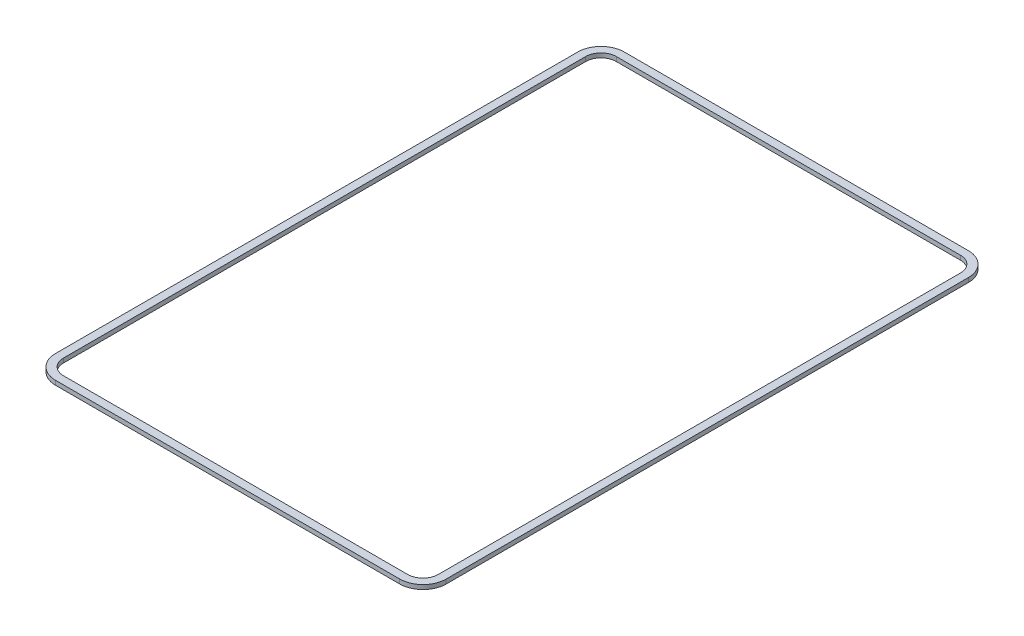
ISO-10303-21;
HEADER;
FILE_DESCRIPTION(('STEP AP214'),'2;1');
FILE_NAME('part.step','',(''),(''),'','','');
FILE_SCHEMA(('AUTOMOTIVE_DESIGN { 1 0 10303 214 1 1 1 1 }'));
ENDSEC;
DATA;
#1=APPLICATION_CONTEXT('core data for automotive mechanical design processes');
#2=APPLICATION_PROTOCOL_DEFINITION('international standard','automotive_design',2000,#1);
#3=PRODUCT_CONTEXT('',#1,'mechanical');
#4=PRODUCT('Part','Part','',(#3));
#5=PRODUCT_RELATED_PRODUCT_CATEGORY('part','',(#4));
#6=PRODUCT_DEFINITION_FORMATION('','',#4);
#7=PRODUCT_DEFINITION_CONTEXT('part definition',#1,'design');
#8=PRODUCT_DEFINITION('design','',#6,#7);
#9=PRODUCT_DEFINITION_SHAPE('','',#8);
#10=(LENGTH_UNIT() NAMED_UNIT(*) SI_UNIT(.MILLI.,.METRE.));
#11=(NAMED_UNIT(*) PLANE_ANGLE_UNIT() SI_UNIT($,.RADIAN.));
#12=(NAMED_UNIT(*) SI_UNIT($,.STERADIAN.) SOLID_ANGLE_UNIT());
#13=UNCERTAINTY_MEASURE_WITH_UNIT(LENGTH_MEASURE(1.E-05),#10,'distance_accuracy_value','');
#14=(GEOMETRIC_REPRESENTATION_CONTEXT(3) GLOBAL_UNCERTAINTY_ASSIGNED_CONTEXT((#13)) GLOBAL_UNIT_ASSIGNED_CONTEXT((#10,
#11,#12)) REPRESENTATION_CONTEXT('',''));
#15=CARTESIAN_POINT('',(0.,0.,0.));
#16=DIRECTION('',(0.,0.,1.));
#17=DIRECTION('',(1.,0.,0.));
#18=AXIS2_PLACEMENT_3D('',#15,#16,#17);
#19=CARTESIAN_POINT('',(-94.75,-113.7,10.25));
#20=DIRECTION('',(0.,0.,1.));
#21=DIRECTION('',(1.,0.,0.));
#22=AXIS2_PLACEMENT_3D('',#19,#20,#21);
#23=PLANE('',#22);
#24=DIRECTION('',(-1.,0.,0.));
#25=VECTOR('',#24,1.);
#26=CARTESIAN_POINT('',(-47.375,-113.8,10.25));
#27=LINE('',#26,#25);
#28=CARTESIAN_POINT('',(87.,-113.8,10.25));
#29=VERTEX_POINT('',#28);
#30=CARTESIAN_POINT('',(-87.,-113.8,10.25));
#31=VERTEX_POINT('',#30);
#32=EDGE_CURVE('E182',#29,#31,#27,.T.);
#33=ORIENTED_EDGE('',*,*,#32,.T.);
#34=DIRECTION('',(0.,-1.,0.));
#35=VECTOR('',#34,1.);
#36=CARTESIAN_POINT('',(-87.,-113.7,10.25));
#37=LINE('',#36,#35);
#38=CARTESIAN_POINT('',(-87.,-116.,10.25));
#39=VERTEX_POINT('',#38);
#40=EDGE_CURVE('E10',#31,#39,#37,.T.);
#41=ORIENTED_EDGE('',*,*,#40,.T.);
#42=DIRECTION('',(-1.,0.,0.));
#43=VECTOR('',#42,1.);
#44=CARTESIAN_POINT('',(-47.375,-116.,10.25));
#45=LINE('',#44,#43);
#46=CARTESIAN_POINT('',(87.,-116.,10.25));
#47=VERTEX_POINT('',#46);
#48=EDGE_CURVE('E238',#47,#39,#45,.T.);
#49=ORIENTED_EDGE('',*,*,#48,.F.);
#50=DIRECTION('',(0.,-1.,0.));
#51=VECTOR('',#50,1.);
#52=CARTESIAN_POINT('',(87.,-113.7,10.25));
#53=LINE('',#52,#51);
#54=EDGE_CURVE('E208',#29,#47,#53,.T.);
#55=ORIENTED_EDGE('',*,*,#54,.F.);
#56=EDGE_LOOP('',(#33,#41,#49,#55));
#57=FACE_BOUND('',#56,.T.);
#58=ADVANCED_FACE('F16',(#57),#23,.T.);
#59=CARTESIAN_POINT('',(-87.,-113.7,18.));
#60=DIRECTION('',(0.,-1.,0.));
#61=DIRECTION('',(0.,0.,-1.));
#62=AXIS2_PLACEMENT_3D('',#59,#60,#61);
#63=CYLINDRICAL_SURFACE('',#62,7.75);
#64=ORIENTED_EDGE('',*,*,#40,.F.);
#65=CARTESIAN_POINT('',(-87.,-113.8,18.));
#66=DIRECTION('',(0.,-1.,0.));
#67=DIRECTION('',(0.,0.,-1.));
#68=AXIS2_PLACEMENT_3D('',#65,#66,#67);
#69=CIRCLE('',#68,7.75);
#70=CARTESIAN_POINT('',(-94.75,-113.8,18.));
#71=VERTEX_POINT('',#70);
#72=EDGE_CURVE('E276',#71,#31,#69,.T.);
#73=ORIENTED_EDGE('',*,*,#72,.F.);
#74=DIRECTION('',(0.,-1.,0.));
#75=VECTOR('',#74,1.);
#76=CARTESIAN_POINT('',(-94.75,-113.7,18.));
#77=LINE('',#76,#75);
#78=CARTESIAN_POINT('',(-94.75,-116.,18.));
#79=VERTEX_POINT('',#78);
#80=EDGE_CURVE('E27',#71,#79,#77,.T.);
#81=ORIENTED_EDGE('',*,*,#80,.T.);
#82=CARTESIAN_POINT('',(-87.,-116.,18.));
#83=DIRECTION('',(0.,-1.,0.));
#84=DIRECTION('',(0.,0.,-1.));
#85=AXIS2_PLACEMENT_3D('',#82,#83,#84);
#86=CIRCLE('',#85,7.75);
#87=EDGE_CURVE('E233',#79,#39,#86,.T.);
#88=ORIENTED_EDGE('',*,*,#87,.T.);
#89=EDGE_LOOP('',(#64,#73,#81,#88));
#90=FACE_BOUND('',#89,.T.);
#91=ADVANCED_FACE('F382',(#90),#63,.F.);
#92=CARTESIAN_POINT('',(-94.75,-113.7,289.75));
#93=DIRECTION('',(1.,0.,0.));
#94=DIRECTION('',(0.,1.,0.));
#95=AXIS2_PLACEMENT_3D('',#92,#93,#94);
#96=PLANE('',#95);
#97=DIRECTION('',(0.,0.,1.));
#98=VECTOR('',#97,1.);
#99=CARTESIAN_POINT('',(-94.75,-113.8,219.875));
#100=LINE('',#99,#98);
#101=CARTESIAN_POINT('',(-94.75,-113.8,282.));
#102=VERTEX_POINT('',#101);
#103=EDGE_CURVE('E273',#71,#102,#100,.T.);
#104=ORIENTED_EDGE('',*,*,#103,.T.);
#105=DIRECTION('',(0.,-1.,0.));
#106=VECTOR('',#105,1.);
#107=CARTESIAN_POINT('',(-94.75,-113.7,282.));
#108=LINE('',#107,#106);
#109=CARTESIAN_POINT('',(-94.75,-116.,282.));
#110=VERTEX_POINT('',#109);
#111=EDGE_CURVE('E224',#102,#110,#108,.T.);
#112=ORIENTED_EDGE('',*,*,#111,.T.);
#113=DIRECTION('',(0.,0.,1.));
#114=VECTOR('',#113,1.);
#115=CARTESIAN_POINT('',(-94.75,-116.,219.875));
#116=LINE('',#115,#114);
#117=EDGE_CURVE('E237',#79,#110,#116,.T.);
#118=ORIENTED_EDGE('',*,*,#117,.F.);
#119=ORIENTED_EDGE('',*,*,#80,.F.);
#120=EDGE_LOOP('',(#104,#112,#118,#119));
#121=FACE_BOUND('',#120,.T.);
#122=ADVANCED_FACE('F386',(#121),#96,.T.);
#123=CARTESIAN_POINT('',(-87.,-113.7,282.));
#124=DIRECTION('',(0.,-1.,0.));
#125=DIRECTION('',(0.,0.,1.));
#126=AXIS2_PLACEMENT_3D('',#123,#124,#125);
#127=CYLINDRICAL_SURFACE('',#126,7.75);
#128=CARTESIAN_POINT('',(-87.,-116.,282.));
#129=DIRECTION('',(0.,-1.,0.));
#130=DIRECTION('',(0.,0.,1.));
#131=AXIS2_PLACEMENT_3D('',#128,#129,#130);
#132=CIRCLE('',#131,7.75);
#133=CARTESIAN_POINT('',(-87.,-116.,289.75));
#134=VERTEX_POINT('',#133);
#135=EDGE_CURVE('E284',#134,#110,#132,.T.);
#136=ORIENTED_EDGE('',*,*,#135,.T.);
#137=ORIENTED_EDGE('',*,*,#111,.F.);
#138=CARTESIAN_POINT('',(-87.,-113.8,282.));
#139=DIRECTION('',(0.,-1.,0.));
#140=DIRECTION('',(0.,0.,1.));
#141=AXIS2_PLACEMENT_3D('',#138,#139,#140);
#142=CIRCLE('',#141,7.75);
#143=CARTESIAN_POINT('',(-87.,-113.8,289.75));
#144=VERTEX_POINT('',#143);
#145=EDGE_CURVE('E269',#144,#102,#142,.T.);
#146=ORIENTED_EDGE('',*,*,#145,.F.);
#147=DIRECTION('',(0.,-1.,0.));
#148=VECTOR('',#147,1.);
#149=CARTESIAN_POINT('',(-87.,-113.7,289.75));
#150=LINE('',#149,#148);
#151=EDGE_CURVE('E223',#144,#134,#150,.T.);
#152=ORIENTED_EDGE('',*,*,#151,.T.);
#153=EDGE_LOOP('',(#136,#137,#146,#152));
#154=FACE_BOUND('',#153,.T.);
#155=ADVANCED_FACE('F310',(#154),#127,.F.);
#156=CARTESIAN_POINT('',(94.75,-113.7,289.75));
#157=DIRECTION('',(0.,0.,-1.));
#158=DIRECTION('',(0.,-1.,0.));
#159=AXIS2_PLACEMENT_3D('',#156,#157,#158);
#160=PLANE('',#159);
#161=DIRECTION('',(1.,0.,0.));
#162=VECTOR('',#161,1.);
#163=CARTESIAN_POINT('',(47.375,-113.8,289.75));
#164=LINE('',#163,#162);
#165=CARTESIAN_POINT('',(87.,-113.8,289.75));
#166=VERTEX_POINT('',#165);
#167=EDGE_CURVE('E265',#144,#166,#164,.T.);
#168=ORIENTED_EDGE('',*,*,#167,.T.);
#169=DIRECTION('',(0.,-1.,0.));
#170=VECTOR('',#169,1.);
#171=CARTESIAN_POINT('',(87.,-113.7,289.75));
#172=LINE('',#171,#170);
#173=CARTESIAN_POINT('',(87.,-116.,289.75));
#174=VERTEX_POINT('',#173);
#175=EDGE_CURVE('E207',#166,#174,#172,.T.);
#176=ORIENTED_EDGE('',*,*,#175,.T.);
#177=DIRECTION('',(1.,0.,0.));
#178=VECTOR('',#177,1.);
#179=CARTESIAN_POINT('',(47.375,-116.,289.75));
#180=LINE('',#179,#178);
#181=EDGE_CURVE('E285',#134,#174,#180,.T.);
#182=ORIENTED_EDGE('',*,*,#181,.F.);
#183=ORIENTED_EDGE('',*,*,#151,.F.);
#184=EDGE_LOOP('',(#168,#176,#182,#183));
#185=FACE_BOUND('',#184,.T.);
#186=ADVANCED_FACE('F318',(#185),#160,.T.);
#187=CARTESIAN_POINT('',(87.,-113.7,282.));
#188=DIRECTION('',(0.,-1.,0.));
#189=DIRECTION('',(1.,0.,0.));
#190=AXIS2_PLACEMENT_3D('',#187,#188,#189);
#191=CYLINDRICAL_SURFACE('',#190,7.75);
#192=CARTESIAN_POINT('',(87.,-116.,282.));
#193=DIRECTION('',(0.,-1.,0.));
#194=DIRECTION('',(1.,0.,0.));
#195=AXIS2_PLACEMENT_3D('',#192,#193,#194);
#196=CIRCLE('',#195,7.75);
#197=CARTESIAN_POINT('',(94.75,-116.,282.));
#198=VERTEX_POINT('',#197);
#199=EDGE_CURVE('E289',#198,#174,#196,.T.);
#200=ORIENTED_EDGE('',*,*,#199,.T.);
#201=ORIENTED_EDGE('',*,*,#175,.F.);
#202=CARTESIAN_POINT('',(87.,-113.8,282.));
#203=DIRECTION('',(0.,-1.,0.));
#204=DIRECTION('',(1.,0.,0.));
#205=AXIS2_PLACEMENT_3D('',#202,#203,#204);
#206=CIRCLE('',#205,7.75);
#207=CARTESIAN_POINT('',(94.75,-113.8,282.));
#208=VERTEX_POINT('',#207);
#209=EDGE_CURVE('E252',#208,#166,#206,.T.);
#210=ORIENTED_EDGE('',*,*,#209,.F.);
#211=DIRECTION('',(0.,-1.,0.));
#212=VECTOR('',#211,1.);
#213=CARTESIAN_POINT('',(94.75,-113.7,282.));
#214=LINE('',#213,#212);
#215=EDGE_CURVE('E41',#208,#198,#214,.T.);
#216=ORIENTED_EDGE('',*,*,#215,.T.);
#217=EDGE_LOOP('',(#200,#201,#210,#216));
#218=FACE_BOUND('',#217,.T.);
#219=ADVANCED_FACE('F368',(#218),#191,.F.);
#220=CARTESIAN_POINT('',(94.75,-113.7,10.25));
#221=DIRECTION('',(-1.,0.,0.));
#222=DIRECTION('',(0.,0.,1.));
#223=AXIS2_PLACEMENT_3D('',#220,#221,#222);
#224=PLANE('',#223);
#225=DIRECTION('',(0.,0.,-1.));
#226=VECTOR('',#225,1.);
#227=CARTESIAN_POINT('',(94.75,-113.8,80.125));
#228=LINE('',#227,#226);
#229=CARTESIAN_POINT('',(94.75,-113.8,18.));
#230=VERTEX_POINT('',#229);
#231=EDGE_CURVE('E243',#208,#230,#228,.T.);
#232=ORIENTED_EDGE('',*,*,#231,.T.);
#233=DIRECTION('',(0.,-1.,0.));
#234=VECTOR('',#233,1.);
#235=CARTESIAN_POINT('',(94.75,-113.7,18.));
#236=LINE('',#235,#234);
#237=CARTESIAN_POINT('',(94.75,-116.,18.));
#238=VERTEX_POINT('',#237);
#239=EDGE_CURVE('E216',#230,#238,#236,.T.);
#240=ORIENTED_EDGE('',*,*,#239,.T.);
#241=DIRECTION('',(0.,0.,-1.));
#242=VECTOR('',#241,1.);
#243=CARTESIAN_POINT('',(94.75,-116.,80.125));
#244=LINE('',#243,#242);
#245=EDGE_CURVE('E189',#198,#238,#244,.T.);
#246=ORIENTED_EDGE('',*,*,#245,.F.);
#247=ORIENTED_EDGE('',*,*,#215,.F.);
#248=EDGE_LOOP('',(#232,#240,#246,#247));
#249=FACE_BOUND('',#248,.T.);
#250=ADVANCED_FACE('F427',(#249),#224,.T.);
#251=CARTESIAN_POINT('',(87.,-113.7,18.));
#252=DIRECTION('',(0.,-1.,0.));
#253=DIRECTION('',(0.,0.,-1.));
#254=AXIS2_PLACEMENT_3D('',#251,#252,#253);
#255=CYLINDRICAL_SURFACE('',#254,7.75);
#256=CARTESIAN_POINT('',(87.,-116.,18.));
#257=DIRECTION('',(0.,-1.,0.));
#258=DIRECTION('',(0.,0.,-1.));
#259=AXIS2_PLACEMENT_3D('',#256,#257,#258);
#260=CIRCLE('',#259,7.75);
#261=EDGE_CURVE('E160',#47,#238,#260,.T.);
#262=ORIENTED_EDGE('',*,*,#261,.T.);
#263=ORIENTED_EDGE('',*,*,#239,.F.);
#264=CARTESIAN_POINT('',(87.,-113.8,18.));
#265=DIRECTION('',(0.,-1.,0.));
#266=DIRECTION('',(0.,0.,-1.));
#267=AXIS2_PLACEMENT_3D('',#264,#265,#266);
#268=CIRCLE('',#267,7.75);
#269=EDGE_CURVE('E175',#29,#230,#268,.T.);
#270=ORIENTED_EDGE('',*,*,#269,.F.);
#271=ORIENTED_EDGE('',*,*,#54,.T.);
#272=EDGE_LOOP('',(#262,#263,#270,#271));
#273=FACE_BOUND('',#272,.T.);
#274=ADVANCED_FACE('F374',(#273),#255,.F.);
#275=CARTESIAN_POINT('',(98.75,-113.8,293.75));
#276=DIRECTION('',(0.,0.,-1.));
#277=DIRECTION('',(0.,-1.,0.));
#278=AXIS2_PLACEMENT_3D('',#275,#276,#277);
#279=PLANE('',#278);
#280=DIRECTION('',(0.,-1.,0.));
#281=VECTOR('',#280,1.);
#282=CARTESIAN_POINT('',(-87.,-113.8,293.75));
#283=LINE('',#282,#281);
#284=CARTESIAN_POINT('',(-87.,-113.8,293.75));
#285=VERTEX_POINT('',#284);
#286=CARTESIAN_POINT('',(-87.,-116.,293.75));
#287=VERTEX_POINT('',#286);
#288=EDGE_CURVE('E80',#285,#287,#283,.T.);
#289=ORIENTED_EDGE('',*,*,#288,.T.);
#290=DIRECTION('',(-1.,0.,0.));
#291=VECTOR('',#290,1.);
#292=CARTESIAN_POINT('',(98.75,-116.,293.75));
#293=LINE('',#292,#291);
#294=CARTESIAN_POINT('',(87.,-116.,293.75));
#295=VERTEX_POINT('',#294);
#296=EDGE_CURVE('E194',#295,#287,#293,.T.);
#297=ORIENTED_EDGE('',*,*,#296,.F.);
#298=DIRECTION('',(0.,-1.,0.));
#299=VECTOR('',#298,1.);
#300=CARTESIAN_POINT('',(87.,-113.8,293.75));
#301=LINE('',#300,#299);
#302=CARTESIAN_POINT('',(87.,-113.8,293.75));
#303=VERTEX_POINT('',#302);
#304=EDGE_CURVE('E220',#303,#295,#301,.T.);
#305=ORIENTED_EDGE('',*,*,#304,.F.);
#306=DIRECTION('',(-1.,0.,0.));
#307=VECTOR('',#306,1.);
#308=CARTESIAN_POINT('',(98.75,-113.8,293.75));
#309=LINE('',#308,#307);
#310=EDGE_CURVE('E201',#303,#285,#309,.T.);
#311=ORIENTED_EDGE('',*,*,#310,.T.);
#312=EDGE_LOOP('',(#289,#297,#305,#311));
#313=FACE_BOUND('',#312,.T.);
#314=ADVANCED_FACE('F416',(#313),#279,.F.);
#315=CARTESIAN_POINT('',(87.,-113.8,282.));
#316=DIRECTION('',(0.,-1.,0.));
#317=DIRECTION('',(1.,0.,0.));
#318=AXIS2_PLACEMENT_3D('',#315,#316,#317);
#319=CYLINDRICAL_SURFACE('',#318,11.75);
#320=CARTESIAN_POINT('',(87.,-113.8,282.));
#321=DIRECTION('',(0.,-1.,0.));
#322=DIRECTION('',(0.,0.,-1.));
#323=AXIS2_PLACEMENT_3D('',#320,#321,#322);
#324=CIRCLE('',#323,11.75);
#325=CARTESIAN_POINT('',(98.75,-113.8,282.));
#326=VERTEX_POINT('',#325);
#327=EDGE_CURVE('E196',#326,#303,#324,.T.);
#328=ORIENTED_EDGE('',*,*,#327,.T.);
#329=ORIENTED_EDGE('',*,*,#304,.T.);
#330=CARTESIAN_POINT('',(87.,-116.,282.));
#331=DIRECTION('',(0.,-1.,0.));
#332=DIRECTION('',(0.,0.,-1.));
#333=AXIS2_PLACEMENT_3D('',#330,#331,#332);
#334=CIRCLE('',#333,11.75);
#335=CARTESIAN_POINT('',(98.75,-116.,282.));
#336=VERTEX_POINT('',#335);
#337=EDGE_CURVE('E190',#336,#295,#334,.T.);
#338=ORIENTED_EDGE('',*,*,#337,.F.);
#339=DIRECTION('',(0.,-1.,0.));
#340=VECTOR('',#339,1.);
#341=CARTESIAN_POINT('',(98.75,-113.8,282.));
#342=LINE('',#341,#340);
#343=EDGE_CURVE('E188',#326,#336,#342,.T.);
#344=ORIENTED_EDGE('',*,*,#343,.F.);
#345=EDGE_LOOP('',(#328,#329,#338,#344));
#346=FACE_BOUND('',#345,.T.);
#347=ADVANCED_FACE('F410',(#346),#319,.T.);
#348=CARTESIAN_POINT('',(-87.,-113.8,282.));
#349=DIRECTION('',(0.,-1.,0.));
#350=DIRECTION('',(0.,0.,1.));
#351=AXIS2_PLACEMENT_3D('',#348,#349,#350);
#352=CYLINDRICAL_SURFACE('',#351,11.75);
#353=CARTESIAN_POINT('',(-87.,-113.8,282.));
#354=DIRECTION('',(0.,-1.,0.));
#355=DIRECTION('',(0.,0.,-1.));
#356=AXIS2_PLACEMENT_3D('',#353,#354,#355);
#357=CIRCLE('',#356,11.75);
#358=CARTESIAN_POINT('',(-98.75,-113.8,282.));
#359=VERTEX_POINT('',#358);
#360=EDGE_CURVE('E204',#285,#359,#357,.T.);
#361=ORIENTED_EDGE('',*,*,#360,.T.);
#362=DIRECTION('',(0.,-1.,0.));
#363=VECTOR('',#362,1.);
#364=CARTESIAN_POINT('',(-98.75,-113.8,282.));
#365=LINE('',#364,#363);
#366=CARTESIAN_POINT('',(-98.75,-116.,282.));
#367=VERTEX_POINT('',#366);
#368=EDGE_CURVE('E95',#359,#367,#365,.T.);
#369=ORIENTED_EDGE('',*,*,#368,.T.);
#370=CARTESIAN_POINT('',(-87.,-116.,282.));
#371=DIRECTION('',(0.,-1.,0.));
#372=DIRECTION('',(0.,0.,-1.));
#373=AXIS2_PLACEMENT_3D('',#370,#371,#372);
#374=CIRCLE('',#373,11.75);
#375=EDGE_CURVE('E20',#287,#367,#374,.T.);
#376=ORIENTED_EDGE('',*,*,#375,.F.);
#377=ORIENTED_EDGE('',*,*,#288,.F.);
#378=EDGE_LOOP('',(#361,#369,#376,#377));
#379=FACE_BOUND('',#378,.T.);
#380=ADVANCED_FACE('F415',(#379),#352,.T.);
#381=CARTESIAN_POINT('',(98.75,-113.8,6.25));
#382=DIRECTION('',(-1.,0.,0.));
#383=DIRECTION('',(0.,0.,1.));
#384=AXIS2_PLACEMENT_3D('',#381,#382,#383);
#385=PLANE('',#384);
#386=ORIENTED_EDGE('',*,*,#343,.T.);
#387=DIRECTION('',(0.,0.,1.));
#388=VECTOR('',#387,1.);
#389=CARTESIAN_POINT('',(98.75,-116.,6.25));
#390=LINE('',#389,#388);
#391=CARTESIAN_POINT('',(98.75,-116.,18.));
#392=VERTEX_POINT('',#391);
#393=EDGE_CURVE('E195',#392,#336,#390,.T.);
#394=ORIENTED_EDGE('',*,*,#393,.F.);
#395=DIRECTION('',(0.,-1.,0.));
#396=VECTOR('',#395,1.);
#397=CARTESIAN_POINT('',(98.75,-113.8,18.));
#398=LINE('',#397,#396);
#399=CARTESIAN_POINT('',(98.75,-113.8,18.));
#400=VERTEX_POINT('',#399);
#401=EDGE_CURVE('E168',#400,#392,#398,.T.);
#402=ORIENTED_EDGE('',*,*,#401,.F.);
#403=DIRECTION('',(0.,0.,1.));
#404=VECTOR('',#403,1.);
#405=CARTESIAN_POINT('',(98.75,-113.8,6.25));
#406=LINE('',#405,#404);
#407=EDGE_CURVE('E200',#400,#326,#406,.T.);
#408=ORIENTED_EDGE('',*,*,#407,.T.);
#409=EDGE_LOOP('',(#386,#394,#402,#408));
#410=FACE_BOUND('',#409,.T.);
#411=ADVANCED_FACE('F296',(#410),#385,.F.);
#412=CARTESIAN_POINT('',(-98.75,-113.8,293.75));
#413=DIRECTION('',(1.,0.,0.));
#414=DIRECTION('',(0.,1.,0.));
#415=AXIS2_PLACEMENT_3D('',#412,#413,#414);
#416=PLANE('',#415);
#417=DIRECTION('',(0.,-1.,0.));
#418=VECTOR('',#417,1.);
#419=CARTESIAN_POINT('',(-98.75,-113.8,18.));
#420=LINE('',#419,#418);
#421=CARTESIAN_POINT('',(-98.75,-113.8,18.));
#422=VERTEX_POINT('',#421);
#423=CARTESIAN_POINT('',(-98.75,-116.,18.));
#424=VERTEX_POINT('',#423);
#425=EDGE_CURVE('E162',#422,#424,#420,.T.);
#426=ORIENTED_EDGE('',*,*,#425,.T.);
#427=DIRECTION('',(0.,0.,-1.));
#428=VECTOR('',#427,1.);
#429=CARTESIAN_POINT('',(-98.75,-116.,293.75));
#430=LINE('',#429,#428);
#431=EDGE_CURVE('E151',#367,#424,#430,.T.);
#432=ORIENTED_EDGE('',*,*,#431,.F.);
#433=ORIENTED_EDGE('',*,*,#368,.F.);
#434=DIRECTION('',(0.,0.,-1.));
#435=VECTOR('',#434,1.);
#436=CARTESIAN_POINT('',(-98.75,-113.8,293.75));
#437=LINE('',#436,#435);
#438=EDGE_CURVE('E164',#359,#422,#437,.T.);
#439=ORIENTED_EDGE('',*,*,#438,.T.);
#440=EDGE_LOOP('',(#426,#432,#433,#439));
#441=FACE_BOUND('',#440,.T.);
#442=ADVANCED_FACE('F18',(#441),#416,.F.);
#443=CARTESIAN_POINT('',(0.,-116.,150.));
#444=DIRECTION('',(0.,-1.,0.));
#445=DIRECTION('',(0.,0.,-1.));
#446=AXIS2_PLACEMENT_3D('',#443,#444,#445);
#447=PLANE('',#446);
#448=ORIENTED_EDGE('',*,*,#261,.F.);
#449=ORIENTED_EDGE('',*,*,#48,.T.);
#450=ORIENTED_EDGE('',*,*,#87,.F.);
#451=ORIENTED_EDGE('',*,*,#117,.T.);
#452=ORIENTED_EDGE('',*,*,#135,.F.);
#453=ORIENTED_EDGE('',*,*,#181,.T.);
#454=ORIENTED_EDGE('',*,*,#199,.F.);
#455=ORIENTED_EDGE('',*,*,#245,.T.);
#456=EDGE_LOOP('',(#448,#449,#450,#451,#452,#453,#454,#455));
#457=FACE_BOUND('',#456,.T.);
#458=DIRECTION('',(1.,0.,0.));
#459=VECTOR('',#458,1.);
#460=CARTESIAN_POINT('',(-98.75,-116.,6.25));
#461=LINE('',#460,#459);
#462=CARTESIAN_POINT('',(-87.,-116.,6.25));
#463=VERTEX_POINT('',#462);
#464=CARTESIAN_POINT('',(87.,-116.,6.25));
#465=VERTEX_POINT('',#464);
#466=EDGE_CURVE('E352',#463,#465,#461,.T.);
#467=ORIENTED_EDGE('',*,*,#466,.T.);
#468=CARTESIAN_POINT('',(87.,-116.,18.));
#469=DIRECTION('',(0.,-1.,0.));
#470=DIRECTION('',(0.,0.,-1.));
#471=AXIS2_PLACEMENT_3D('',#468,#469,#470);
#472=CIRCLE('',#471,11.75);
#473=EDGE_CURVE('E229',#465,#392,#472,.T.);
#474=ORIENTED_EDGE('',*,*,#473,.T.);
#475=ORIENTED_EDGE('',*,*,#393,.T.);
#476=ORIENTED_EDGE('',*,*,#337,.T.);
#477=ORIENTED_EDGE('',*,*,#296,.T.);
#478=ORIENTED_EDGE('',*,*,#375,.T.);
#479=ORIENTED_EDGE('',*,*,#431,.T.);
#480=CARTESIAN_POINT('',(-87.,-116.,18.));
#481=DIRECTION('',(0.,1.,0.));
#482=DIRECTION('',(0.,0.,-1.));
#483=AXIS2_PLACEMENT_3D('',#480,#481,#482);
#484=CIRCLE('',#483,11.75);
#485=EDGE_CURVE('E156',#463,#424,#484,.T.);
#486=ORIENTED_EDGE('',*,*,#485,.F.);
#487=EDGE_LOOP('',(#467,#474,#475,#476,#477,#478,#479,#486));
#488=FACE_BOUND('',#487,.T.);
#489=ADVANCED_FACE('F154',(#457,#488),#447,.T.);
#490=CARTESIAN_POINT('',(87.,-113.8,18.));
#491=DIRECTION('',(0.,-1.,0.));
#492=DIRECTION('',(0.,0.,-1.));
#493=AXIS2_PLACEMENT_3D('',#490,#491,#492);
#494=CYLINDRICAL_SURFACE('',#493,11.75);
#495=CARTESIAN_POINT('',(87.,-113.8,18.));
#496=DIRECTION('',(0.,-1.,0.));
#497=DIRECTION('',(0.,0.,-1.));
#498=AXIS2_PLACEMENT_3D('',#495,#496,#497);
#499=CIRCLE('',#498,11.75);
#500=CARTESIAN_POINT('',(87.,-113.8,6.25));
#501=VERTEX_POINT('',#500);
#502=EDGE_CURVE('E240',#501,#400,#499,.T.);
#503=ORIENTED_EDGE('',*,*,#502,.T.);
#504=ORIENTED_EDGE('',*,*,#401,.T.);
#505=ORIENTED_EDGE('',*,*,#473,.F.);
#506=DIRECTION('',(0.,-1.,0.));
#507=VECTOR('',#506,1.);
#508=CARTESIAN_POINT('',(87.,-113.8,6.25));
#509=LINE('',#508,#507);
#510=EDGE_CURVE('E354',#501,#465,#509,.T.);
#511=ORIENTED_EDGE('',*,*,#510,.F.);
#512=EDGE_LOOP('',(#503,#504,#505,#511));
#513=FACE_BOUND('',#512,.T.);
#514=ADVANCED_FACE('F295',(#513),#494,.T.);
#515=CARTESIAN_POINT('',(-87.,-113.8,18.));
#516=DIRECTION('',(0.,-1.,0.));
#517=DIRECTION('',(0.,0.,-1.));
#518=AXIS2_PLACEMENT_3D('',#515,#516,#517);
#519=CYLINDRICAL_SURFACE('',#518,11.75);
#520=DIRECTION('',(0.,-1.,0.));
#521=VECTOR('',#520,1.);
#522=CARTESIAN_POINT('',(-87.,-113.8,6.25));
#523=LINE('',#522,#521);
#524=CARTESIAN_POINT('',(-87.,-113.8,6.25));
#525=VERTEX_POINT('',#524);
#526=EDGE_CURVE('E172',#525,#463,#523,.T.);
#527=ORIENTED_EDGE('',*,*,#526,.T.);
#528=ORIENTED_EDGE('',*,*,#485,.T.);
#529=ORIENTED_EDGE('',*,*,#425,.F.);
#530=CARTESIAN_POINT('',(-87.,-113.8,18.));
#531=DIRECTION('',(0.,1.,0.));
#532=DIRECTION('',(0.,0.,-1.));
#533=AXIS2_PLACEMENT_3D('',#530,#531,#532);
#534=CIRCLE('',#533,11.75);
#535=EDGE_CURVE('E213',#525,#422,#534,.T.);
#536=ORIENTED_EDGE('',*,*,#535,.F.);
#537=EDGE_LOOP('',(#527,#528,#529,#536));
#538=FACE_BOUND('',#537,.T.);
#539=ADVANCED_FACE('F170',(#538),#519,.T.);
#540=CARTESIAN_POINT('',(0.,-113.8,150.));
#541=DIRECTION('',(0.,-1.,0.));
#542=DIRECTION('',(0.,0.,-1.));
#543=AXIS2_PLACEMENT_3D('',#540,#541,#542);
#544=PLANE('',#543);
#545=ORIENTED_EDGE('',*,*,#231,.F.);
#546=ORIENTED_EDGE('',*,*,#209,.T.);
#547=ORIENTED_EDGE('',*,*,#167,.F.);
#548=ORIENTED_EDGE('',*,*,#145,.T.);
#549=ORIENTED_EDGE('',*,*,#103,.F.);
#550=ORIENTED_EDGE('',*,*,#72,.T.);
#551=ORIENTED_EDGE('',*,*,#32,.F.);
#552=ORIENTED_EDGE('',*,*,#269,.T.);
#553=EDGE_LOOP('',(#545,#546,#547,#548,#549,#550,#551,#552));
#554=FACE_BOUND('',#553,.T.);
#555=ORIENTED_EDGE('',*,*,#535,.T.);
#556=ORIENTED_EDGE('',*,*,#438,.F.);
#557=ORIENTED_EDGE('',*,*,#360,.F.);
#558=ORIENTED_EDGE('',*,*,#310,.F.);
#559=ORIENTED_EDGE('',*,*,#327,.F.);
#560=ORIENTED_EDGE('',*,*,#407,.F.);
#561=ORIENTED_EDGE('',*,*,#502,.F.);
#562=DIRECTION('',(1.,0.,0.));
#563=VECTOR('',#562,1.);
#564=CARTESIAN_POINT('',(-98.75,-113.8,6.25));
#565=LINE('',#564,#563);
#566=EDGE_CURVE('E337',#525,#501,#565,.T.);
#567=ORIENTED_EDGE('',*,*,#566,.F.);
#568=EDGE_LOOP('',(#555,#556,#557,#558,#559,#560,#561,#567));
#569=FACE_BOUND('',#568,.T.);
#570=ADVANCED_FACE('F366',(#554,#569),#544,.F.);
#571=CARTESIAN_POINT('',(-98.75,-113.8,6.25));
#572=DIRECTION('',(0.,0.,1.));
#573=DIRECTION('',(1.,0.,0.));
#574=AXIS2_PLACEMENT_3D('',#571,#572,#573);
#575=PLANE('',#574);
#576=ORIENTED_EDGE('',*,*,#510,.T.);
#577=ORIENTED_EDGE('',*,*,#466,.F.);
#578=ORIENTED_EDGE('',*,*,#526,.F.);
#579=ORIENTED_EDGE('',*,*,#566,.T.);
#580=EDGE_LOOP('',(#576,#577,#578,#579));
#581=FACE_BOUND('',#580,.T.);
#582=ADVANCED_FACE('F458',(#581),#575,.F.);
#583=CLOSED_SHELL('',(#58,#91,#122,#155,#186,#219,#250,#274,#314,#347,#380,#411,#442,#489,#514,
#539,#570,#582));
#584=MANIFOLD_SOLID_BREP('B1',#583);
#585=ADVANCED_BREP_SHAPE_REPRESENTATION('',(#18,#584),#14);
#586=SHAPE_DEFINITION_REPRESENTATION(#9,#585);
ENDSEC;
END-ISO-10303-21;
